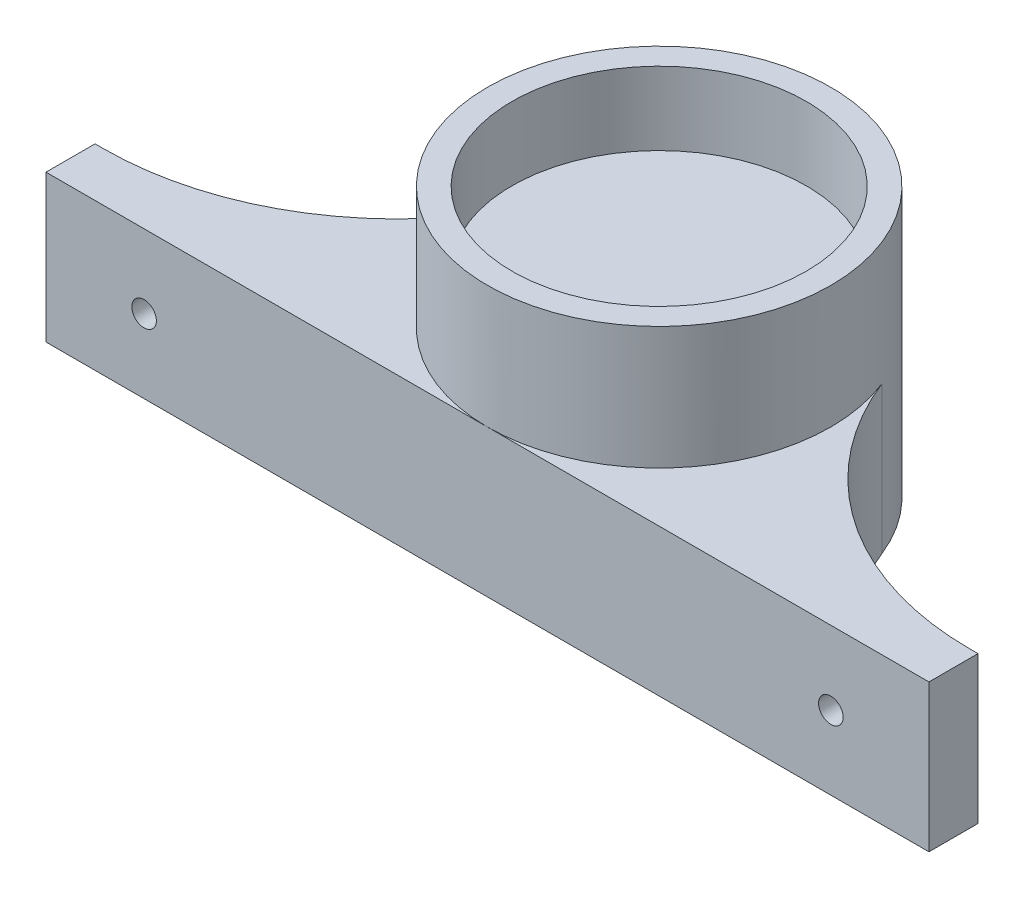
ISO-10303-21;
HEADER;
FILE_DESCRIPTION(('STEP AP214'),'2;1');
FILE_NAME('part.step','',(''),(''),'','','');
FILE_SCHEMA(('AUTOMOTIVE_DESIGN { 1 0 10303 214 1 1 1 1 }'));
ENDSEC;
DATA;
#1=APPLICATION_CONTEXT('core data for automotive mechanical design processes');
#2=APPLICATION_PROTOCOL_DEFINITION('international standard','automotive_design',2000,#1);
#3=PRODUCT_CONTEXT('',#1,'mechanical');
#4=PRODUCT('Part','Part','',(#3));
#5=PRODUCT_RELATED_PRODUCT_CATEGORY('part','',(#4));
#6=PRODUCT_DEFINITION_FORMATION('','',#4);
#7=PRODUCT_DEFINITION_CONTEXT('part definition',#1,'design');
#8=PRODUCT_DEFINITION('design','',#6,#7);
#9=PRODUCT_DEFINITION_SHAPE('','',#8);
#10=(LENGTH_UNIT() NAMED_UNIT(*) SI_UNIT(.MILLI.,.METRE.));
#11=(NAMED_UNIT(*) PLANE_ANGLE_UNIT() SI_UNIT($,.RADIAN.));
#12=(NAMED_UNIT(*) SI_UNIT($,.STERADIAN.) SOLID_ANGLE_UNIT());
#13=UNCERTAINTY_MEASURE_WITH_UNIT(LENGTH_MEASURE(1.E-05),#10,'distance_accuracy_value','');
#14=(GEOMETRIC_REPRESENTATION_CONTEXT(3) GLOBAL_UNCERTAINTY_ASSIGNED_CONTEXT((#13)) GLOBAL_UNIT_ASSIGNED_CONTEXT((#10,
#11,#12)) REPRESENTATION_CONTEXT('',''));
#15=CARTESIAN_POINT('',(0.,0.,0.));
#16=DIRECTION('',(0.,0.,1.));
#17=DIRECTION('',(1.,0.,0.));
#18=AXIS2_PLACEMENT_3D('',#15,#16,#17);
#19=CARTESIAN_POINT('',(0.,31.75,0.));
#20=DIRECTION('',(0.,1.,0.));
#21=DIRECTION('',(1.,0.,0.));
#22=AXIS2_PLACEMENT_3D('',#19,#20,#21);
#23=PLANE('',#22);
#24=CARTESIAN_POINT('',(0.,31.75,0.));
#25=DIRECTION('',(0.,-1.,0.));
#26=DIRECTION('',(1.,0.,0.));
#27=AXIS2_PLACEMENT_3D('',#24,#25,#26);
#28=CIRCLE('',#27,38.1);
#29=CARTESIAN_POINT('',(38.1,31.75,0.));
#30=VERTEX_POINT('',#29);
#31=EDGE_CURVE('E31',#30,#30,#28,.T.);
#32=ORIENTED_EDGE('',*,*,#31,.T.);
#33=EDGE_LOOP('',(#32));
#34=FACE_BOUND('',#33,.T.);
#35=CARTESIAN_POINT('',(0.,31.75,0.));
#36=DIRECTION('',(0.,1.,0.));
#37=DIRECTION('',(-1.,0.,0.));
#38=AXIS2_PLACEMENT_3D('',#35,#36,#37);
#39=CIRCLE('',#38,44.45);
#40=CARTESIAN_POINT('',(-44.45,31.75,0.));
#41=VERTEX_POINT('',#40);
#42=EDGE_CURVE('E221',#41,#41,#39,.T.);
#43=ORIENTED_EDGE('',*,*,#42,.T.);
#44=EDGE_LOOP('',(#43));
#45=FACE_BOUND('',#44,.T.);
#46=ADVANCED_FACE('F17',(#34,#45),#23,.T.);
#47=CARTESIAN_POINT('',(0.,12.827,0.));
#48=DIRECTION('',(0.,1.,0.));
#49=DIRECTION('',(1.,0.,0.));
#50=AXIS2_PLACEMENT_3D('',#47,#48,#49);
#51=PLANE('',#50);
#52=CARTESIAN_POINT('',(0.,12.827,0.));
#53=DIRECTION('',(0.,-1.,0.));
#54=DIRECTION('',(1.,0.,0.));
#55=AXIS2_PLACEMENT_3D('',#52,#53,#54);
#56=CIRCLE('',#55,38.1);
#57=CARTESIAN_POINT('',(38.1,12.827,0.));
#58=VERTEX_POINT('',#57);
#59=EDGE_CURVE('E11',#58,#58,#56,.T.);
#60=ORIENTED_EDGE('',*,*,#59,.F.);
#61=EDGE_LOOP('',(#60));
#62=FACE_BOUND('',#61,.T.);
#63=ADVANCED_FACE('F210',(#62),#51,.T.);
#64=CARTESIAN_POINT('',(0.,31.75,0.));
#65=DIRECTION('',(0.,-1.,0.));
#66=DIRECTION('',(1.,0.,0.));
#67=AXIS2_PLACEMENT_3D('',#64,#65,#66);
#68=CYLINDRICAL_SURFACE('',#67,38.1);
#69=ORIENTED_EDGE('',*,*,#59,.T.);
#70=EDGE_LOOP('',(#69));
#71=FACE_BOUND('',#70,.T.);
#72=ORIENTED_EDGE('',*,*,#31,.F.);
#73=EDGE_LOOP('',(#72));
#74=FACE_BOUND('',#73,.T.);
#75=ADVANCED_FACE('F215',(#71,#74),#68,.F.);
#76=CARTESIAN_POINT('',(0.,0.,0.));
#77=DIRECTION('',(0.,-1.,0.));
#78=DIRECTION('',(0.,0.,-1.));
#79=AXIS2_PLACEMENT_3D('',#76,#77,#78);
#80=PLANE('',#79);
#81=CARTESIAN_POINT('',(0.,0.,0.));
#82=DIRECTION('',(0.,1.,0.));
#83=DIRECTION('',(-1.,0.,0.));
#84=AXIS2_PLACEMENT_3D('',#81,#82,#83);
#85=CIRCLE('',#84,44.45);
#86=CARTESIAN_POINT('',(-41.3233442640289,0.,-16.3763157894737));
#87=VERTEX_POINT('',#86);
#88=CARTESIAN_POINT('',(0.,0.,44.45));
#89=VERTEX_POINT('',#88);
#90=EDGE_CURVE('E241',#87,#89,#85,.T.);
#91=ORIENTED_EDGE('',*,*,#90,.F.);
#92=CARTESIAN_POINT('',(-112.163363002364,0.,-44.45));
#93=DIRECTION('',(0.,1.,0.));
#94=DIRECTION('',(0.561951486949016,0.,0.827170191868511));
#95=AXIS2_PLACEMENT_3D('',#92,#93,#94);
#96=CIRCLE('',#95,76.2);
#97=CARTESIAN_POINT('',(-112.163363002364,0.,31.75));
#98=VERTEX_POINT('',#97);
#99=EDGE_CURVE('E180',#98,#87,#96,.T.);
#100=ORIENTED_EDGE('',*,*,#99,.F.);
#101=DIRECTION('',(1.,0.,0.));
#102=VECTOR('',#101,1.);
#103=CARTESIAN_POINT('',(-114.3,0.,31.75));
#104=LINE('',#103,#102);
#105=CARTESIAN_POINT('',(-114.3,0.,31.75));
#106=VERTEX_POINT('',#105);
#107=EDGE_CURVE('E160',#106,#98,#104,.T.);
#108=ORIENTED_EDGE('',*,*,#107,.F.);
#109=DIRECTION('',(0.,0.,-1.));
#110=VECTOR('',#109,1.);
#111=CARTESIAN_POINT('',(-114.3,0.,44.45));
#112=LINE('',#111,#110);
#113=CARTESIAN_POINT('',(-114.3,0.,44.45));
#114=VERTEX_POINT('',#113);
#115=EDGE_CURVE('E161',#114,#106,#112,.T.);
#116=ORIENTED_EDGE('',*,*,#115,.F.);
#117=DIRECTION('',(-1.,0.,0.));
#118=VECTOR('',#117,1.);
#119=CARTESIAN_POINT('',(114.3,0.,44.45));
#120=LINE('',#119,#118);
#121=EDGE_CURVE('E170',#89,#114,#120,.T.);
#122=ORIENTED_EDGE('',*,*,#121,.F.);
#123=EDGE_LOOP('',(#91,#100,#108,#116,#122));
#124=FACE_BOUND('',#123,.T.);
#125=ADVANCED_FACE('F287',(#124),#80,.F.);
#126=CARTESIAN_POINT('',(0.,-38.1,0.));
#127=DIRECTION('',(0.,-1.,0.));
#128=DIRECTION('',(0.,0.,-1.));
#129=AXIS2_PLACEMENT_3D('',#126,#127,#128);
#130=PLANE('',#129);
#131=CARTESIAN_POINT('',(20.8596500450033,-38.1,-20.8596500450031));
#132=DIRECTION('',(0.,1.,0.));
#133=DIRECTION('',(1.,0.,0.));
#134=AXIS2_PLACEMENT_3D('',#131,#132,#133);
#135=CIRCLE('',#134,1.5);
#136=CARTESIAN_POINT('',(22.3596500450033,-38.1,-20.8596500450031));
#137=VERTEX_POINT('',#136);
#138=EDGE_CURVE('E242',#137,#137,#135,.T.);
#139=ORIENTED_EDGE('',*,*,#138,.T.);
#140=EDGE_LOOP('',(#139));
#141=FACE_BOUND('',#140,.T.);
#142=CARTESIAN_POINT('',(-20.8596500450031,-38.1,-20.8596500450033));
#143=DIRECTION('',(0.,1.,0.));
#144=DIRECTION('',(1.,0.,0.));
#145=AXIS2_PLACEMENT_3D('',#142,#143,#144);
#146=CIRCLE('',#145,1.5);
#147=CARTESIAN_POINT('',(-19.3596500450031,-38.1,-20.8596500450033));
#148=VERTEX_POINT('',#147);
#149=EDGE_CURVE('E307',#148,#148,#146,.T.);
#150=ORIENTED_EDGE('',*,*,#149,.T.);
#151=EDGE_LOOP('',(#150));
#152=FACE_BOUND('',#151,.T.);
#153=CARTESIAN_POINT('',(20.8596500450031,-38.1,20.8596500450033));
#154=DIRECTION('',(0.,1.,0.));
#155=DIRECTION('',(1.,0.,0.));
#156=AXIS2_PLACEMENT_3D('',#153,#154,#155);
#157=CIRCLE('',#156,1.5);
#158=CARTESIAN_POINT('',(22.3596500450031,-38.1,20.8596500450033));
#159=VERTEX_POINT('',#158);
#160=EDGE_CURVE('E314',#159,#159,#157,.T.);
#161=ORIENTED_EDGE('',*,*,#160,.T.);
#162=EDGE_LOOP('',(#161));
#163=FACE_BOUND('',#162,.T.);
#164=CARTESIAN_POINT('',(-20.8596500450033,-38.1,20.8596500450031));
#165=DIRECTION('',(0.,1.,0.));
#166=DIRECTION('',(1.,0.,0.));
#167=AXIS2_PLACEMENT_3D('',#164,#165,#166);
#168=CIRCLE('',#167,1.5);
#169=CARTESIAN_POINT('',(-19.3596500450033,-38.1,20.8596500450031));
#170=VERTEX_POINT('',#169);
#171=EDGE_CURVE('E325',#170,#170,#168,.T.);
#172=ORIENTED_EDGE('',*,*,#171,.T.);
#173=EDGE_LOOP('',(#172));
#174=FACE_BOUND('',#173,.T.);
#175=DIRECTION('',(1.,0.,0.));
#176=VECTOR('',#175,1.);
#177=CARTESIAN_POINT('',(0.,-38.1,31.75));
#178=LINE('',#177,#176);
#179=CARTESIAN_POINT('',(112.163363002364,-38.1,31.75));
#180=VERTEX_POINT('',#179);
#181=CARTESIAN_POINT('',(114.3,-38.1,31.75));
#182=VERTEX_POINT('',#181);
#183=EDGE_CURVE('E122',#180,#182,#178,.T.);
#184=ORIENTED_EDGE('',*,*,#183,.T.);
#185=DIRECTION('',(0.,0.,1.));
#186=VECTOR('',#185,1.);
#187=CARTESIAN_POINT('',(114.3,-38.1,31.75));
#188=LINE('',#187,#186);
#189=CARTESIAN_POINT('',(114.3,-38.1,44.45));
#190=VERTEX_POINT('',#189);
#191=EDGE_CURVE('E44',#182,#190,#188,.T.);
#192=ORIENTED_EDGE('',*,*,#191,.T.);
#193=DIRECTION('',(-1.,0.,0.));
#194=VECTOR('',#193,1.);
#195=CARTESIAN_POINT('',(114.3,-38.1,44.45));
#196=LINE('',#195,#194);
#197=CARTESIAN_POINT('',(-114.3,-38.1,44.45));
#198=VERTEX_POINT('',#197);
#199=EDGE_CURVE('E51',#190,#198,#196,.T.);
#200=ORIENTED_EDGE('',*,*,#199,.T.);
#201=DIRECTION('',(0.,0.,-1.));
#202=VECTOR('',#201,1.);
#203=CARTESIAN_POINT('',(-114.3,-38.1,44.45));
#204=LINE('',#203,#202);
#205=CARTESIAN_POINT('',(-114.3,-38.1,31.75));
#206=VERTEX_POINT('',#205);
#207=EDGE_CURVE('E164',#198,#206,#204,.T.);
#208=ORIENTED_EDGE('',*,*,#207,.T.);
#209=DIRECTION('',(1.,0.,0.));
#210=VECTOR('',#209,1.);
#211=CARTESIAN_POINT('',(-114.3,-38.1,31.75));
#212=LINE('',#211,#210);
#213=CARTESIAN_POINT('',(-112.163363002364,-38.1,31.75));
#214=VERTEX_POINT('',#213);
#215=EDGE_CURVE('E150',#206,#214,#212,.T.);
#216=ORIENTED_EDGE('',*,*,#215,.T.);
#217=CARTESIAN_POINT('',(-112.163363002364,-38.1,-44.45));
#218=DIRECTION('',(0.,-1.,0.));
#219=DIRECTION('',(0.561951486949016,0.,0.827170191868511));
#220=AXIS2_PLACEMENT_3D('',#217,#218,#219);
#221=CIRCLE('',#220,76.2);
#222=CARTESIAN_POINT('',(-41.3233442640286,-38.1,-16.3763157894737));
#223=VERTEX_POINT('',#222);
#224=EDGE_CURVE('E234',#223,#214,#221,.T.);
#225=ORIENTED_EDGE('',*,*,#224,.F.);
#226=CARTESIAN_POINT('',(0.,-38.1,0.));
#227=DIRECTION('',(0.,-1.,0.));
#228=DIRECTION('',(1.,0.,0.));
#229=AXIS2_PLACEMENT_3D('',#226,#227,#228);
#230=CIRCLE('',#229,44.45);
#231=CARTESIAN_POINT('',(41.3233442640289,-38.1,-16.3763157894737));
#232=VERTEX_POINT('',#231);
#233=EDGE_CURVE('E238',#223,#232,#230,.T.);
#234=ORIENTED_EDGE('',*,*,#233,.T.);
#235=CARTESIAN_POINT('',(112.163363002364,-38.1,-44.45));
#236=DIRECTION('',(0.,-1.,0.));
#237=DIRECTION('',(-0.561951486949017,0.,0.827170191868511));
#238=AXIS2_PLACEMENT_3D('',#235,#236,#237);
#239=CIRCLE('',#238,76.2);
#240=EDGE_CURVE('E125',#180,#232,#239,.T.);
#241=ORIENTED_EDGE('',*,*,#240,.F.);
#242=EDGE_LOOP('',(#184,#192,#200,#208,#216,#225,#234,#241));
#243=FACE_BOUND('',#242,.T.);
#244=ADVANCED_FACE('F123',(#141,#152,#163,#174,#243),#130,.T.);
#245=CARTESIAN_POINT('',(114.3,0.,31.75));
#246=DIRECTION('',(1.,0.,0.));
#247=DIRECTION('',(0.,0.,-1.));
#248=AXIS2_PLACEMENT_3D('',#245,#246,#247);
#249=PLANE('',#248);
#250=DIRECTION('',(0.,0.,1.));
#251=VECTOR('',#250,1.);
#252=CARTESIAN_POINT('',(114.3,0.,31.75));
#253=LINE('',#252,#251);
#254=CARTESIAN_POINT('',(114.3,0.,31.75));
#255=VERTEX_POINT('',#254);
#256=CARTESIAN_POINT('',(114.3,0.,44.45));
#257=VERTEX_POINT('',#256);
#258=EDGE_CURVE('E147',#255,#257,#253,.T.);
#259=ORIENTED_EDGE('',*,*,#258,.T.);
#260=DIRECTION('',(0.,-1.,0.));
#261=VECTOR('',#260,1.);
#262=CARTESIAN_POINT('',(114.3,0.,44.45));
#263=LINE('',#262,#261);
#264=EDGE_CURVE('E118',#257,#190,#263,.T.);
#265=ORIENTED_EDGE('',*,*,#264,.T.);
#266=ORIENTED_EDGE('',*,*,#191,.F.);
#267=DIRECTION('',(0.,-1.,0.));
#268=VECTOR('',#267,1.);
#269=CARTESIAN_POINT('',(114.3,0.,31.75));
#270=LINE('',#269,#268);
#271=EDGE_CURVE('E116',#255,#182,#270,.T.);
#272=ORIENTED_EDGE('',*,*,#271,.F.);
#273=EDGE_LOOP('',(#259,#265,#266,#272));
#274=FACE_BOUND('',#273,.T.);
#275=ADVANCED_FACE('F114',(#274),#249,.T.);
#276=CARTESIAN_POINT('',(114.3,0.,44.45));
#277=DIRECTION('',(0.,0.,1.));
#278=DIRECTION('',(1.,0.,0.));
#279=AXIS2_PLACEMENT_3D('',#276,#277,#278);
#280=PLANE('',#279);
#281=CARTESIAN_POINT('',(-88.9,-19.05,44.45));
#282=DIRECTION('',(0.,0.,-1.));
#283=DIRECTION('',(1.,0.,0.));
#284=AXIS2_PLACEMENT_3D('',#281,#282,#283);
#285=CIRCLE('',#284,3.175);
#286=CARTESIAN_POINT('',(-85.725,-19.05,44.45));
#287=VERTEX_POINT('',#286);
#288=EDGE_CURVE('E181',#287,#287,#285,.T.);
#289=ORIENTED_EDGE('',*,*,#288,.T.);
#290=EDGE_LOOP('',(#289));
#291=FACE_BOUND('',#290,.T.);
#292=CARTESIAN_POINT('',(88.9,-19.05,44.45));
#293=DIRECTION('',(0.,0.,-1.));
#294=DIRECTION('',(1.,0.,0.));
#295=AXIS2_PLACEMENT_3D('',#292,#293,#294);
#296=CIRCLE('',#295,3.175);
#297=CARTESIAN_POINT('',(92.075,-19.05,44.45));
#298=VERTEX_POINT('',#297);
#299=EDGE_CURVE('E251',#298,#298,#296,.T.);
#300=ORIENTED_EDGE('',*,*,#299,.T.);
#301=EDGE_LOOP('',(#300));
#302=FACE_BOUND('',#301,.T.);
#303=DIRECTION('',(-1.,0.,0.));
#304=VECTOR('',#303,1.);
#305=CARTESIAN_POINT('',(114.3,0.,44.45));
#306=LINE('',#305,#304);
#307=EDGE_CURVE('E130',#257,#89,#306,.T.);
#308=ORIENTED_EDGE('',*,*,#307,.T.);
#309=ORIENTED_EDGE('',*,*,#121,.T.);
#310=DIRECTION('',(0.,-1.,0.));
#311=VECTOR('',#310,1.);
#312=CARTESIAN_POINT('',(-114.3,0.,44.45));
#313=LINE('',#312,#311);
#314=EDGE_CURVE('E167',#114,#198,#313,.T.);
#315=ORIENTED_EDGE('',*,*,#314,.T.);
#316=ORIENTED_EDGE('',*,*,#199,.F.);
#317=ORIENTED_EDGE('',*,*,#264,.F.);
#318=EDGE_LOOP('',(#308,#309,#315,#316,#317));
#319=FACE_BOUND('',#318,.T.);
#320=ADVANCED_FACE('F205',(#291,#302,#319),#280,.T.);
#321=CARTESIAN_POINT('',(-114.3,0.,44.45));
#322=DIRECTION('',(-1.,0.,0.));
#323=DIRECTION('',(0.,0.,1.));
#324=AXIS2_PLACEMENT_3D('',#321,#322,#323);
#325=PLANE('',#324);
#326=ORIENTED_EDGE('',*,*,#115,.T.);
#327=DIRECTION('',(0.,-1.,0.));
#328=VECTOR('',#327,1.);
#329=CARTESIAN_POINT('',(-114.3,0.,31.75));
#330=LINE('',#329,#328);
#331=EDGE_CURVE('E156',#106,#206,#330,.T.);
#332=ORIENTED_EDGE('',*,*,#331,.T.);
#333=ORIENTED_EDGE('',*,*,#207,.F.);
#334=ORIENTED_EDGE('',*,*,#314,.F.);
#335=EDGE_LOOP('',(#326,#332,#333,#334));
#336=FACE_BOUND('',#335,.T.);
#337=ADVANCED_FACE('F196',(#336),#325,.T.);
#338=CARTESIAN_POINT('',(-114.3,0.,31.75));
#339=DIRECTION('',(0.,0.,-1.));
#340=DIRECTION('',(0.,-1.,0.));
#341=AXIS2_PLACEMENT_3D('',#338,#339,#340);
#342=PLANE('',#341);
#343=DIRECTION('',(0.,1.,0.));
#344=VECTOR('',#343,1.);
#345=CARTESIAN_POINT('',(-112.163363002364,0.,31.75));
#346=LINE('',#345,#344);
#347=EDGE_CURVE('E225',#214,#98,#346,.T.);
#348=ORIENTED_EDGE('',*,*,#347,.F.);
#349=ORIENTED_EDGE('',*,*,#215,.F.);
#350=ORIENTED_EDGE('',*,*,#331,.F.);
#351=ORIENTED_EDGE('',*,*,#107,.T.);
#352=EDGE_LOOP('',(#348,#349,#350,#351));
#353=FACE_BOUND('',#352,.T.);
#354=ADVANCED_FACE('F193',(#353),#342,.T.);
#355=CARTESIAN_POINT('',(0.,0.,0.));
#356=DIRECTION('',(0.,-1.,0.));
#357=DIRECTION('',(0.,0.,-1.));
#358=AXIS2_PLACEMENT_3D('',#355,#356,#357);
#359=PLANE('',#358);
#360=CARTESIAN_POINT('',(0.,0.,0.));
#361=DIRECTION('',(0.,1.,0.));
#362=DIRECTION('',(-1.,0.,0.));
#363=AXIS2_PLACEMENT_3D('',#360,#361,#362);
#364=CIRCLE('',#363,44.45);
#365=CARTESIAN_POINT('',(41.3233442640289,0.,-16.3763157894737));
#366=VERTEX_POINT('',#365);
#367=EDGE_CURVE('E224',#89,#366,#364,.T.);
#368=ORIENTED_EDGE('',*,*,#367,.F.);
#369=ORIENTED_EDGE('',*,*,#307,.F.);
#370=ORIENTED_EDGE('',*,*,#258,.F.);
#371=DIRECTION('',(1.,0.,0.));
#372=VECTOR('',#371,1.);
#373=CARTESIAN_POINT('',(0.,0.,31.75));
#374=LINE('',#373,#372);
#375=CARTESIAN_POINT('',(112.163363002364,0.,31.75));
#376=VERTEX_POINT('',#375);
#377=EDGE_CURVE('E133',#376,#255,#374,.T.);
#378=ORIENTED_EDGE('',*,*,#377,.F.);
#379=CARTESIAN_POINT('',(112.163363002364,0.,-44.45));
#380=DIRECTION('',(0.,1.,0.));
#381=DIRECTION('',(-0.561951486949017,0.,0.827170191868511));
#382=AXIS2_PLACEMENT_3D('',#379,#380,#381);
#383=CIRCLE('',#382,76.2);
#384=EDGE_CURVE('E252',#366,#376,#383,.T.);
#385=ORIENTED_EDGE('',*,*,#384,.F.);
#386=EDGE_LOOP('',(#368,#369,#370,#378,#385));
#387=FACE_BOUND('',#386,.T.);
#388=ADVANCED_FACE('F195',(#387),#359,.F.);
#389=CARTESIAN_POINT('',(31.1085197333464,0.,31.75));
#390=DIRECTION('',(0.,0.,-1.));
#391=DIRECTION('',(0.,-1.,0.));
#392=AXIS2_PLACEMENT_3D('',#389,#390,#391);
#393=PLANE('',#392);
#394=DIRECTION('',(0.,-1.,0.));
#395=VECTOR('',#394,1.);
#396=CARTESIAN_POINT('',(112.163363002364,0.,31.75));
#397=LINE('',#396,#395);
#398=EDGE_CURVE('E141',#376,#180,#397,.T.);
#399=ORIENTED_EDGE('',*,*,#398,.F.);
#400=ORIENTED_EDGE('',*,*,#377,.T.);
#401=ORIENTED_EDGE('',*,*,#271,.T.);
#402=ORIENTED_EDGE('',*,*,#183,.F.);
#403=EDGE_LOOP('',(#399,#400,#401,#402));
#404=FACE_BOUND('',#403,.T.);
#405=ADVANCED_FACE('F132',(#404),#393,.T.);
#406=CARTESIAN_POINT('',(112.163363002364,0.,-44.45));
#407=DIRECTION('',(0.,-1.,0.));
#408=DIRECTION('',(-0.561951486949017,0.,0.827170191868511));
#409=AXIS2_PLACEMENT_3D('',#406,#407,#408);
#410=CYLINDRICAL_SURFACE('',#409,76.2);
#411=CARTESIAN_POINT('',(92.075,-19.05,29.0544057991442));
#412=CARTESIAN_POINT('',(92.0749921770069,-18.8766766499208,29.0544041575793));
#413=CARTESIAN_POINT('',(92.0607412810292,-18.7031164243601,29.0505135517775));
#414=CARTESIAN_POINT('',(92.0041543446147,-18.3607449940921,29.035012997145));
#415=CARTESIAN_POINT('',(91.9617583116776,-18.1919447384164,29.0233865589538));
#416=CARTESIAN_POINT('',(91.8503739546823,-17.8643415489801,28.9926700662075));
#417=CARTESIAN_POINT('',(91.7814250042019,-17.7055242158977,28.973591061977));
#418=CARTESIAN_POINT('',(91.6192656239623,-17.402024534575,28.9283831358735));
#419=CARTESIAN_POINT('',(91.5260654911455,-17.2573362229883,28.9022572059213));
#420=CARTESIAN_POINT('',(91.316920953681,-16.9838047225385,28.8430951013783));
#421=CARTESIAN_POINT('',(91.2006803451377,-16.8552078314373,28.8099685156811));
#422=CARTESIAN_POINT('',(90.94988764278,-16.6193129297004,28.7377412477881));
#423=CARTESIAN_POINT('',(90.8153315760592,-16.512019552576,28.6986392692107));
#424=CARTESIAN_POINT('',(90.5270209162275,-16.317850287472,28.6138897970299));
#425=CARTESIAN_POINT('',(90.3727710378486,-16.2317873534412,28.5680656990952));
#426=CARTESIAN_POINT('',(90.0533423714475,-16.0866879023315,28.4719775164272));
#427=CARTESIAN_POINT('',(89.8881615403202,-16.0276564541319,28.4217126010689));
#428=CARTESIAN_POINT('',(89.5445355411901,-15.9358258883771,28.3158039062627));
#429=CARTESIAN_POINT('',(89.3658240869981,-15.9041783497447,28.2600250558414));
#430=CARTESIAN_POINT('',(89.0062919002556,-15.8716471346545,28.1463196719446));
#431=CARTESIAN_POINT('',(88.8254707542603,-15.870769593173,28.08839271248));
#432=CARTESIAN_POINT('',(88.4606467575762,-15.9000552294887,27.9700192160533));
#433=CARTESIAN_POINT('',(88.2767308284395,-15.9312257396235,27.9095518816686));
#434=CARTESIAN_POINT('',(87.9168031868053,-16.0253414218356,27.7897421308236));
#435=CARTESIAN_POINT('',(87.7407924666719,-16.0882905711058,27.7303998561327));
#436=CARTESIAN_POINT('',(87.400496224097,-16.2451024722036,27.614366974539));
#437=CARTESIAN_POINT('',(87.236301208933,-16.3391781248306,27.5576977895625));
#438=CARTESIAN_POINT('',(86.9260995249373,-16.5559807071459,27.4495656481313));
#439=CARTESIAN_POINT('',(86.780089237227,-16.6787019221648,27.3981016561936));
#440=CARTESIAN_POINT('',(86.5152966299465,-16.9456992071408,27.3039956093425));
#441=CARTESIAN_POINT('',(86.3958257206085,-17.0892132238065,27.261134232919));
#442=CARTESIAN_POINT('',(86.183011928079,-17.3966528963274,27.1843088432495));
#443=CARTESIAN_POINT('',(86.0896723045268,-17.5605810949838,27.1503459400408));
#444=CARTESIAN_POINT('',(85.9374457590756,-17.8943376973941,27.0947239143966));
#445=CARTESIAN_POINT('',(85.8769086182702,-18.0633077990997,27.0724774781398));
#446=CARTESIAN_POINT('',(85.8080659391457,-18.322944380182,27.0471249522305));
#447=CARTESIAN_POINT('',(85.7887847028201,-18.4104568722961,27.040012473967));
#448=CARTESIAN_POINT('',(85.7576719687688,-18.5869571392644,27.0285266145699));
#449=CARTESIAN_POINT('',(85.7458360157263,-18.6759439990585,27.0241515953273));
#450=CARTESIAN_POINT('',(85.7335306954894,-18.8126053736425,27.0196018061177));
#451=CARTESIAN_POINT('',(85.7303334802681,-18.86001880901,27.0184193189641));
#452=CARTESIAN_POINT('',(85.7260668948778,-18.95494821119,27.0168410887988));
#453=CARTESIAN_POINT('',(85.724997531095,-19.0024641783098,27.0164453481484));
#454=CARTESIAN_POINT('',(85.7250088449357,-19.2202986900754,27.0164501910949));
#455=CARTESIAN_POINT('',(85.7387741787582,-19.3908522046017,27.0215466937866));
#456=CARTESIAN_POINT('',(85.793366673748,-19.7272058106488,27.0417065513885));
#457=CARTESIAN_POINT('',(85.8342549531678,-19.8929942824154,27.0567924159718));
#458=CARTESIAN_POINT('',(85.941442636685,-20.2145616200041,27.0961677514752));
#459=CARTESIAN_POINT('',(86.0076841825646,-20.3703623404189,27.1204362654151));
#460=CARTESIAN_POINT('',(86.1631982006932,-20.6682657145803,27.1770775962315));
#461=CARTESIAN_POINT('',(86.2524622562022,-20.8103733483223,27.2094474512318));
#462=CARTESIAN_POINT('',(86.4539961666575,-21.0815069515577,27.2820027184674));
#463=CARTESIAN_POINT('',(86.5668450907841,-21.2100494905067,27.3223832182222));
#464=CARTESIAN_POINT('',(86.8105046333805,-21.4465572021287,27.4088148434515));
#465=CARTESIAN_POINT('',(86.9413210070104,-21.5545157549697,27.4548677853781));
#466=CARTESIAN_POINT('',(87.2253796123882,-21.7533369308565,27.553894699));
#467=CARTESIAN_POINT('',(87.3794813509551,-21.842849404143,27.6071149225788));
#468=CARTESIAN_POINT('',(87.6996071130005,-21.9946710030117,27.7164275268266));
#469=CARTESIAN_POINT('',(87.8656341179494,-22.056973297938,27.7725206247383));
#470=CARTESIAN_POINT('',(88.2132926509182,-22.1553481701954,27.8885735000797));
#471=CARTESIAN_POINT('',(88.3952908211096,-22.1900607092344,27.9485915512516));
#472=CARTESIAN_POINT('',(88.7627108340637,-22.2274022409939,28.0681826442785));
#473=CARTESIAN_POINT('',(88.948133123878,-22.2300270142623,28.1277556265788));
#474=CARTESIAN_POINT('',(89.3200933771881,-22.2026873746373,28.2456921594482));
#475=CARTESIAN_POINT('',(89.5066056823134,-22.1722286168828,28.3040237122876));
#476=CARTESIAN_POINT('',(89.8723532556373,-22.0783314123819,28.4169165254101));
#477=CARTESIAN_POINT('',(90.0515889379983,-22.0148948454733,28.4714780003985));
#478=CARTESIAN_POINT('',(90.3938475767806,-21.8578149650029,28.5743764897937));
#479=CARTESIAN_POINT('',(90.5571129389067,-21.7647652535479,28.6228116609945));
#480=CARTESIAN_POINT('',(90.8657959693362,-21.5503120285013,28.7133756476696));
#481=CARTESIAN_POINT('',(91.0112190047154,-21.4289170733794,28.7555063604033));
#482=CARTESIAN_POINT('',(91.2738524978526,-21.1662678514906,28.8308729102134));
#483=CARTESIAN_POINT('',(91.3919438562583,-21.0259758706953,28.8643921646689));
#484=CARTESIAN_POINT('',(91.6028374483073,-20.7259752770836,28.9238157708343));
#485=CARTESIAN_POINT('',(91.6956335612293,-20.5662619783628,28.9497182796302));
#486=CARTESIAN_POINT('',(91.8493938603384,-20.2387718834313,28.9924182766284));
#487=CARTESIAN_POINT('',(91.91145347044,-20.0715484263707,29.0095300576709));
#488=CARTESIAN_POINT('',(92.0066785339983,-19.728734275168,29.035716654214));
#489=CARTESIAN_POINT('',(92.0399119196761,-19.5531642871385,29.0448103660322));
#490=CARTESIAN_POINT('',(92.0637973290237,-19.3220201727657,29.0513433247057));
#491=CARTESIAN_POINT('',(92.0679948767528,-19.2677139027233,29.0524910350608));
#492=CARTESIAN_POINT('',(92.073597443895,-19.1589462244741,29.0540225308599));
#493=CARTESIAN_POINT('',(92.0750024591859,-19.1044848160384,29.0544063151761));
#494=CARTESIAN_POINT('',(92.075,-19.05,29.0544057991442));
#495=B_SPLINE_CURVE_WITH_KNOTS('',3,(#411,#412,#413,#414,#415,#416,#417,#418,#419,#420,#421,
#422,#423,#424,#425,#426,#427,#428,#429,#430,#431,#432,#433,#434,#435,#436,#437,#438,#439,#440,
#441,#442,#443,#444,#445,#446,#447,#448,#449,#450,#451,#452,#453,#454,#455,#456,#457,#458,#459,
#460,#461,#462,#463,#464,#465,#466,#467,#468,#469,#470,#471,#472,#473,#474,#475,#476,#477,#478,
#479,#480,#481,#482,#483,#484,#485,#486,#487,#488,#489,#490,#491,#492,#493,#494),.UNSPECIFIED.,
.T.,.F.,(4,2,2,2,2,2,2,2,2,2,2,2,2,2,2,2,2,2,2,2,2,2,2,2,2,2,2,2,2,2,2,2,2,2,2,2,2,2,2,2,2,4),
(0.,0.51975941738875,1.04063029561155,1.56073176419463,2.08061275937734,2.60767022509868,
3.13484220047452,3.67983766705319,4.22493528806623,4.79197472406133,5.35912721673376,
5.94466806754762,6.530282218744,7.11998767619418,7.70957559027553,8.28137484460411,
8.85324539392249,9.39276685957812,9.66215156744575,9.93137491962324,10.073931893537,
10.2164892953067,10.7272060120634,11.2390774939509,11.7497877420566,12.2603115449215,
12.7852688344515,13.3103946670905,13.8658964324424,14.4215375670926,15.0031138968566,
15.5847667014686,16.1752318353254,16.7656633145217,17.3449350154762,17.924032038689,
18.4804824804831,19.0370674479892,19.5720559213805,20.1057801823026,20.2691681760453,
20.43255641097),.UNSPECIFIED.);
#496=CARTESIAN_POINT('',(92.075,-19.05,29.0544057991442));
#497=VERTEX_POINT('',#496);
#498=EDGE_CURVE('E20',#497,#497,#495,.T.);
#499=ORIENTED_EDGE('',*,*,#498,.T.);
#500=EDGE_LOOP('',(#499));
#501=FACE_BOUND('',#500,.T.);
#502=ORIENTED_EDGE('',*,*,#384,.T.);
#503=ORIENTED_EDGE('',*,*,#398,.T.);
#504=ORIENTED_EDGE('',*,*,#240,.T.);
#505=DIRECTION('',(0.,1.,0.));
#506=VECTOR('',#505,1.);
#507=CARTESIAN_POINT('',(41.3233442640289,0.,-16.3763157894737));
#508=LINE('',#507,#506);
#509=EDGE_CURVE('E230',#232,#366,#508,.T.);
#510=ORIENTED_EDGE('',*,*,#509,.T.);
#511=EDGE_LOOP('',(#502,#503,#504,#510));
#512=FACE_BOUND('',#511,.T.);
#513=ADVANCED_FACE('F294',(#501,#512),#410,.F.);
#514=CARTESIAN_POINT('',(0.,0.,0.));
#515=DIRECTION('',(0.,1.,0.));
#516=DIRECTION('',(-1.,0.,0.));
#517=AXIS2_PLACEMENT_3D('',#514,#515,#516);
#518=CYLINDRICAL_SURFACE('',#517,44.45);
#519=ORIENTED_EDGE('',*,*,#90,.T.);
#520=ORIENTED_EDGE('',*,*,#367,.T.);
#521=ORIENTED_EDGE('',*,*,#509,.F.);
#522=ORIENTED_EDGE('',*,*,#233,.F.);
#523=DIRECTION('',(0.,-1.,0.));
#524=VECTOR('',#523,1.);
#525=CARTESIAN_POINT('',(-41.3233442640289,0.,-16.3763157894737));
#526=LINE('',#525,#524);
#527=EDGE_CURVE('E268',#87,#223,#526,.T.);
#528=ORIENTED_EDGE('',*,*,#527,.F.);
#529=EDGE_LOOP('',(#519,#520,#521,#522,#528));
#530=FACE_BOUND('',#529,.T.);
#531=ORIENTED_EDGE('',*,*,#42,.F.);
#532=EDGE_LOOP('',(#531));
#533=FACE_BOUND('',#532,.T.);
#534=ADVANCED_FACE('F191',(#530,#533),#518,.T.);
#535=CARTESIAN_POINT('',(-112.163363002364,0.,-44.45));
#536=DIRECTION('',(0.,-1.,0.));
#537=DIRECTION('',(0.561951486949016,0.,0.827170191868511));
#538=AXIS2_PLACEMENT_3D('',#535,#536,#537);
#539=CYLINDRICAL_SURFACE('',#538,76.2);
#540=CARTESIAN_POINT('',(-85.725,-19.05,27.0164464049756));
#541=CARTESIAN_POINT('',(-85.7250088449357,-18.8797013099246,27.0164501910949));
#542=CARTESIAN_POINT('',(-85.7387741787582,-18.7091477953983,27.0215466937866));
#543=CARTESIAN_POINT('',(-85.793366673748,-18.3727941893512,27.0417065513884));
#544=CARTESIAN_POINT('',(-85.8342549531678,-18.2070057175846,27.0567924159718));
#545=CARTESIAN_POINT('',(-85.941442636685,-17.8854383799959,27.0961677514752));
#546=CARTESIAN_POINT('',(-86.0076841825646,-17.7296376595811,27.1204362654151));
#547=CARTESIAN_POINT('',(-86.1631982006932,-17.4317342854197,27.1770775962315));
#548=CARTESIAN_POINT('',(-86.2524622562022,-17.2896266516777,27.2094474512318));
#549=CARTESIAN_POINT('',(-86.4539961666575,-17.0184930484423,27.2820027184674));
#550=CARTESIAN_POINT('',(-86.5668450907841,-16.8899505094933,27.3223832182222));
#551=CARTESIAN_POINT('',(-86.8105046333805,-16.6534427978713,27.4088148434515));
#552=CARTESIAN_POINT('',(-86.9413210070104,-16.5454842450303,27.4548677853781));
#553=CARTESIAN_POINT('',(-87.2253796123881,-16.3466630691435,27.553894699));
#554=CARTESIAN_POINT('',(-87.3794813509551,-16.257150595857,27.6071149225788));
#555=CARTESIAN_POINT('',(-87.6996071130005,-16.1053289969883,27.7164275268266));
#556=CARTESIAN_POINT('',(-87.8656341179494,-16.043026702062,27.7725206247383));
#557=CARTESIAN_POINT('',(-88.2132926509181,-15.9446518298046,27.8885735000797));
#558=CARTESIAN_POINT('',(-88.3952908211096,-15.9099392907656,27.9485915512516));
#559=CARTESIAN_POINT('',(-88.7627108340637,-15.8725977590061,28.0681826442784));
#560=CARTESIAN_POINT('',(-88.948133123878,-15.8699729857377,28.1277556265788));
#561=CARTESIAN_POINT('',(-89.320093377188,-15.8973126253627,28.2456921594482));
#562=CARTESIAN_POINT('',(-89.5066056823133,-15.9277713831172,28.3040237122876));
#563=CARTESIAN_POINT('',(-89.8723532556373,-16.0216685876181,28.4169165254101));
#564=CARTESIAN_POINT('',(-90.0515889379982,-16.0851051545267,28.4714780003985));
#565=CARTESIAN_POINT('',(-90.3938475767806,-16.2421850349971,28.5743764897936));
#566=CARTESIAN_POINT('',(-90.5571129389066,-16.3352347464521,28.6228116609945));
#567=CARTESIAN_POINT('',(-90.8657959693362,-16.5496879714987,28.7133756476696));
#568=CARTESIAN_POINT('',(-91.0112190047153,-16.6710829266206,28.7555063604033));
#569=CARTESIAN_POINT('',(-91.2738524978526,-16.9337321485094,28.8308729102134));
#570=CARTESIAN_POINT('',(-91.3919438562582,-17.0740241293047,28.8643921646689));
#571=CARTESIAN_POINT('',(-91.6028374483073,-17.3740247229164,28.9238157708343));
#572=CARTESIAN_POINT('',(-91.6956335612292,-17.5337380216372,28.9497182796301));
#573=CARTESIAN_POINT('',(-91.8493938603384,-17.8612281165687,28.9924182766284));
#574=CARTESIAN_POINT('',(-91.9114534704399,-18.0284515736293,29.0095300576708));
#575=CARTESIAN_POINT('',(-92.0066785339982,-18.371265724832,29.035716654214));
#576=CARTESIAN_POINT('',(-92.0399119196761,-18.5468357128615,29.0448103660322));
#577=CARTESIAN_POINT('',(-92.0637973290237,-18.7779798272343,29.0513433247056));
#578=CARTESIAN_POINT('',(-92.0679948767528,-18.8322860972767,29.0524910350608));
#579=CARTESIAN_POINT('',(-92.0735974438949,-18.9410537755259,29.0540225308599));
#580=CARTESIAN_POINT('',(-92.0750024591859,-18.9955151839616,29.0544063151761));
#581=CARTESIAN_POINT('',(-92.0749921770069,-19.2233233500792,29.0544041575794));
#582=CARTESIAN_POINT('',(-92.0607412810292,-19.3968835756399,29.0505135517775));
#583=CARTESIAN_POINT('',(-92.0041543446147,-19.7392550059079,29.035012997145));
#584=CARTESIAN_POINT('',(-91.9617583116776,-19.9080552615836,29.0233865589538));
#585=CARTESIAN_POINT('',(-91.8503739546823,-20.2356584510199,28.9926700662075));
#586=CARTESIAN_POINT('',(-91.7814250042018,-20.3944757841023,28.973591061977));
#587=CARTESIAN_POINT('',(-91.6192656239623,-20.697975465425,28.9283831358735));
#588=CARTESIAN_POINT('',(-91.5260654911455,-20.8426637770117,28.9022572059213));
#589=CARTESIAN_POINT('',(-91.316920953681,-21.1161952774615,28.8430951013783));
#590=CARTESIAN_POINT('',(-91.2006803451377,-21.2447921685627,28.8099685156811));
#591=CARTESIAN_POINT('',(-90.94988764278,-21.4806870702996,28.7377412477881));
#592=CARTESIAN_POINT('',(-90.8153315760592,-21.587980447424,28.6986392692107));
#593=CARTESIAN_POINT('',(-90.5270209162275,-21.782149712528,28.6138897970299));
#594=CARTESIAN_POINT('',(-90.3727710378486,-21.8682126465588,28.5680656990952));
#595=CARTESIAN_POINT('',(-90.0533423714475,-22.0133120976685,28.4719775164272));
#596=CARTESIAN_POINT('',(-89.8881615403201,-22.0723435458681,28.4217126010689));
#597=CARTESIAN_POINT('',(-89.5445355411901,-22.1641741116229,28.3158039062627));
#598=CARTESIAN_POINT('',(-89.365824086998,-22.1958216502553,28.2600250558414));
#599=CARTESIAN_POINT('',(-89.0062919002556,-22.2283528653455,28.1463196719446));
#600=CARTESIAN_POINT('',(-88.8254707542603,-22.229230406827,28.08839271248));
#601=CARTESIAN_POINT('',(-88.4606467575762,-22.1999447705113,27.9700192160533));
#602=CARTESIAN_POINT('',(-88.2767308284395,-22.1687742603765,27.9095518816685));
#603=CARTESIAN_POINT('',(-87.9168031868053,-22.0746585781644,27.7897421308236));
#604=CARTESIAN_POINT('',(-87.7407924666719,-22.0117094288942,27.7303998561327));
#605=CARTESIAN_POINT('',(-87.400496224097,-21.8548975277964,27.614366974539));
#606=CARTESIAN_POINT('',(-87.2363012089329,-21.7608218751694,27.5576977895625));
#607=CARTESIAN_POINT('',(-86.9260995249373,-21.5440192928541,27.4495656481312));
#608=CARTESIAN_POINT('',(-86.780089237227,-21.4212980778352,27.3981016561936));
#609=CARTESIAN_POINT('',(-86.5152966299465,-21.1543007928593,27.3039956093424));
#610=CARTESIAN_POINT('',(-86.3958257206085,-21.0107867761935,27.261134232919));
#611=CARTESIAN_POINT('',(-86.183011928079,-20.7033471036726,27.1843088432495));
#612=CARTESIAN_POINT('',(-86.0896723045268,-20.5394189050162,27.1503459400408));
#613=CARTESIAN_POINT('',(-85.9374457590756,-20.205662302606,27.0947239143966));
#614=CARTESIAN_POINT('',(-85.8769086182702,-20.0366922009003,27.0724774781398));
#615=CARTESIAN_POINT('',(-85.8080659391457,-19.777055619818,27.0471249522305));
#616=CARTESIAN_POINT('',(-85.7887847028201,-19.6895431277039,27.040012473967));
#617=CARTESIAN_POINT('',(-85.7576719687688,-19.5130428607356,27.0285266145699));
#618=CARTESIAN_POINT('',(-85.7458360157262,-19.4240560009415,27.0241515953273));
#619=CARTESIAN_POINT('',(-85.7335306954894,-19.2873946263575,27.0196018061177));
#620=CARTESIAN_POINT('',(-85.7303334802681,-19.23998119099,27.0184193189641));
#621=CARTESIAN_POINT('',(-85.7260668948778,-19.14505178881,27.0168410887988));
#622=CARTESIAN_POINT('',(-85.724997531095,-19.0975358216902,27.0164453481484));
#623=CARTESIAN_POINT('',(-85.725,-19.05,27.0164464049756));
#624=B_SPLINE_CURVE_WITH_KNOTS('',3,(#540,#541,#542,#543,#544,#545,#546,#547,#548,#549,#550,
#551,#552,#553,#554,#555,#556,#557,#558,#559,#560,#561,#562,#563,#564,#565,#566,#567,#568,#569,
#570,#571,#572,#573,#574,#575,#576,#577,#578,#579,#580,#581,#582,#583,#584,#585,#586,#587,#588,
#589,#590,#591,#592,#593,#594,#595,#596,#597,#598,#599,#600,#601,#602,#603,#604,#605,#606,#607,
#608,#609,#610,#611,#612,#613,#614,#615,#616,#617,#618,#619,#620,#621,#622,#623),.UNSPECIFIED.,
.T.,.F.,(4,2,2,2,2,2,2,2,2,2,2,2,2,2,2,2,2,2,2,2,2,2,2,2,2,2,2,2,2,2,2,2,2,2,2,2,2,2,2,2,2,4),
(0.,0.51071671675665,1.0225881986442,1.5332984467499,2.04382224961475,2.5687795391448,
3.09390537178373,3.64940713713573,4.20504827178586,4.78662460154996,5.36827740616187,
5.95874254001861,6.54917401921499,7.12844572016949,7.70754274338227,8.26399318517637,
8.82057815268248,9.35556662607377,9.88929088699591,10.0526788807386,10.2160671156633,
10.735826533052,11.2566974112748,11.7767988798579,12.2966798750406,12.823737340762,
13.3509093161378,13.8959047827165,14.4410024037295,15.0080418397246,15.575194332397,
16.1607351832109,16.7463493344073,17.3360547918575,17.9256427059388,18.4974419602674,
19.0693125095858,19.6088339752414,19.8782186831091,20.1474420352865,20.2899990092003,
20.43255641097),.UNSPECIFIED.);
#625=CARTESIAN_POINT('',(-85.725,-19.05,27.0164464049756));
#626=VERTEX_POINT('',#625);
#627=EDGE_CURVE('E172',#626,#626,#624,.T.);
#628=ORIENTED_EDGE('',*,*,#627,.T.);
#629=EDGE_LOOP('',(#628));
#630=FACE_BOUND('',#629,.T.);
#631=ORIENTED_EDGE('',*,*,#99,.T.);
#632=ORIENTED_EDGE('',*,*,#527,.T.);
#633=ORIENTED_EDGE('',*,*,#224,.T.);
#634=ORIENTED_EDGE('',*,*,#347,.T.);
#635=EDGE_LOOP('',(#631,#632,#633,#634));
#636=FACE_BOUND('',#635,.T.);
#637=ADVANCED_FACE('F182',(#630,#636),#539,.F.);
#638=CARTESIAN_POINT('',(-88.9,-19.05,44.45));
#639=DIRECTION('',(0.,0.,-1.));
#640=DIRECTION('',(1.,0.,0.));
#641=AXIS2_PLACEMENT_3D('',#638,#639,#640);
#642=CYLINDRICAL_SURFACE('',#641,3.175);
#643=ORIENTED_EDGE('',*,*,#627,.F.);
#644=EDGE_LOOP('',(#643));
#645=FACE_BOUND('',#644,.T.);
#646=ORIENTED_EDGE('',*,*,#288,.F.);
#647=EDGE_LOOP('',(#646));
#648=FACE_BOUND('',#647,.T.);
#649=ADVANCED_FACE('F185',(#645,#648),#642,.F.);
#650=CARTESIAN_POINT('',(88.9,-19.05,44.45));
#651=DIRECTION('',(0.,0.,-1.));
#652=DIRECTION('',(1.,0.,0.));
#653=AXIS2_PLACEMENT_3D('',#650,#651,#652);
#654=CYLINDRICAL_SURFACE('',#653,3.175);
#655=ORIENTED_EDGE('',*,*,#498,.F.);
#656=EDGE_LOOP('',(#655));
#657=FACE_BOUND('',#656,.T.);
#658=ORIENTED_EDGE('',*,*,#299,.F.);
#659=EDGE_LOOP('',(#658));
#660=FACE_BOUND('',#659,.T.);
#661=ADVANCED_FACE('F189',(#657,#660),#654,.F.);
#662=CARTESIAN_POINT('',(20.8596500450033,3.175,-20.8596500450031));
#663=DIRECTION('',(0.,-1.,0.));
#664=DIRECTION('',(0.,0.,-1.));
#665=AXIS2_PLACEMENT_3D('',#662,#663,#664);
#666=PLANE('',#665);
#667=CARTESIAN_POINT('',(20.8596500450033,3.175,-20.8596500450031));
#668=DIRECTION('',(0.,1.,0.));
#669=DIRECTION('',(1.,0.,0.));
#670=AXIS2_PLACEMENT_3D('',#667,#668,#669);
#671=CIRCLE('',#670,1.5);
#672=CARTESIAN_POINT('',(22.3596500450033,3.175,-20.8596500450031));
#673=VERTEX_POINT('',#672);
#674=EDGE_CURVE('E246',#673,#673,#671,.T.);
#675=ORIENTED_EDGE('',*,*,#674,.F.);
#676=EDGE_LOOP('',(#675));
#677=FACE_BOUND('',#676,.T.);
#678=ADVANCED_FACE('F355',(#677),#666,.T.);
#679=CARTESIAN_POINT('',(20.8596500450033,-38.1,-20.8596500450031));
#680=DIRECTION('',(0.,1.,0.));
#681=DIRECTION('',(1.,0.,0.));
#682=AXIS2_PLACEMENT_3D('',#679,#680,#681);
#683=CYLINDRICAL_SURFACE('',#682,1.5);
#684=ORIENTED_EDGE('',*,*,#674,.T.);
#685=EDGE_LOOP('',(#684));
#686=FACE_BOUND('',#685,.T.);
#687=ORIENTED_EDGE('',*,*,#138,.F.);
#688=EDGE_LOOP('',(#687));
#689=FACE_BOUND('',#688,.T.);
#690=ADVANCED_FACE('F358',(#686,#689),#683,.F.);
#691=CARTESIAN_POINT('',(-20.8596500450031,3.175,-20.8596500450033));
#692=DIRECTION('',(0.,-1.,0.));
#693=DIRECTION('',(0.,0.,-1.));
#694=AXIS2_PLACEMENT_3D('',#691,#692,#693);
#695=PLANE('',#694);
#696=CARTESIAN_POINT('',(-20.8596500450031,3.175,-20.8596500450033));
#697=DIRECTION('',(0.,1.,0.));
#698=DIRECTION('',(1.,0.,0.));
#699=AXIS2_PLACEMENT_3D('',#696,#697,#698);
#700=CIRCLE('',#699,1.5);
#701=CARTESIAN_POINT('',(-19.3596500450031,3.175,-20.8596500450033));
#702=VERTEX_POINT('',#701);
#703=EDGE_CURVE('E247',#702,#702,#700,.T.);
#704=ORIENTED_EDGE('',*,*,#703,.F.);
#705=EDGE_LOOP('',(#704));
#706=FACE_BOUND('',#705,.T.);
#707=ADVANCED_FACE('F362',(#706),#695,.T.);
#708=CARTESIAN_POINT('',(-20.8596500450031,-38.1,-20.8596500450033));
#709=DIRECTION('',(0.,1.,0.));
#710=DIRECTION('',(1.,0.,0.));
#711=AXIS2_PLACEMENT_3D('',#708,#709,#710);
#712=CYLINDRICAL_SURFACE('',#711,1.5);
#713=ORIENTED_EDGE('',*,*,#703,.T.);
#714=EDGE_LOOP('',(#713));
#715=FACE_BOUND('',#714,.T.);
#716=ORIENTED_EDGE('',*,*,#149,.F.);
#717=EDGE_LOOP('',(#716));
#718=FACE_BOUND('',#717,.T.);
#719=ADVANCED_FACE('F350',(#715,#718),#712,.F.);
#720=CARTESIAN_POINT('',(20.8596500450031,3.175,20.8596500450033));
#721=DIRECTION('',(0.,-1.,0.));
#722=DIRECTION('',(0.,0.,-1.));
#723=AXIS2_PLACEMENT_3D('',#720,#721,#722);
#724=PLANE('',#723);
#725=CARTESIAN_POINT('',(20.8596500450031,3.175,20.8596500450033));
#726=DIRECTION('',(0.,1.,0.));
#727=DIRECTION('',(1.,0.,0.));
#728=AXIS2_PLACEMENT_3D('',#725,#726,#727);
#729=CIRCLE('',#728,1.5);
#730=CARTESIAN_POINT('',(22.3596500450031,3.175,20.8596500450033));
#731=VERTEX_POINT('',#730);
#732=EDGE_CURVE('E310',#731,#731,#729,.T.);
#733=ORIENTED_EDGE('',*,*,#732,.F.);
#734=EDGE_LOOP('',(#733));
#735=FACE_BOUND('',#734,.T.);
#736=ADVANCED_FACE('F348',(#735),#724,.T.);
#737=CARTESIAN_POINT('',(20.8596500450031,-38.1,20.8596500450033));
#738=DIRECTION('',(0.,1.,0.));
#739=DIRECTION('',(1.,0.,0.));
#740=AXIS2_PLACEMENT_3D('',#737,#738,#739);
#741=CYLINDRICAL_SURFACE('',#740,1.5);
#742=ORIENTED_EDGE('',*,*,#732,.T.);
#743=EDGE_LOOP('',(#742));
#744=FACE_BOUND('',#743,.T.);
#745=ORIENTED_EDGE('',*,*,#160,.F.);
#746=EDGE_LOOP('',(#745));
#747=FACE_BOUND('',#746,.T.);
#748=ADVANCED_FACE('F344',(#744,#747),#741,.F.);
#749=CARTESIAN_POINT('',(-20.8596500450033,3.175,20.8596500450031));
#750=DIRECTION('',(0.,-1.,0.));
#751=DIRECTION('',(0.,0.,-1.));
#752=AXIS2_PLACEMENT_3D('',#749,#750,#751);
#753=PLANE('',#752);
#754=CARTESIAN_POINT('',(-20.8596500450033,3.175,20.8596500450031));
#755=DIRECTION('',(0.,1.,0.));
#756=DIRECTION('',(1.,0.,0.));
#757=AXIS2_PLACEMENT_3D('',#754,#755,#756);
#758=CIRCLE('',#757,1.5);
#759=CARTESIAN_POINT('',(-19.3596500450033,3.175,20.8596500450031));
#760=VERTEX_POINT('',#759);
#761=EDGE_CURVE('E305',#760,#760,#758,.T.);
#762=ORIENTED_EDGE('',*,*,#761,.F.);
#763=EDGE_LOOP('',(#762));
#764=FACE_BOUND('',#763,.T.);
#765=ADVANCED_FACE('F338',(#764),#753,.T.);
#766=CARTESIAN_POINT('',(-20.8596500450033,-38.1,20.8596500450031));
#767=DIRECTION('',(0.,1.,0.));
#768=DIRECTION('',(1.,0.,0.));
#769=AXIS2_PLACEMENT_3D('',#766,#767,#768);
#770=CYLINDRICAL_SURFACE('',#769,1.5);
#771=ORIENTED_EDGE('',*,*,#761,.T.);
#772=EDGE_LOOP('',(#771));
#773=FACE_BOUND('',#772,.T.);
#774=ORIENTED_EDGE('',*,*,#171,.F.);
#775=EDGE_LOOP('',(#774));
#776=FACE_BOUND('',#775,.T.);
#777=ADVANCED_FACE('F336',(#773,#776),#770,.F.);
#778=CLOSED_SHELL('',(#46,#63,#75,#125,#244,#275,#320,#337,#354,#388,#405,#513,#534,#637,#649,
#661,#678,#690,#707,#719,#736,#748,#765,#777));
#779=MANIFOLD_SOLID_BREP('B1',#778);
#780=ADVANCED_BREP_SHAPE_REPRESENTATION('',(#18,#779),#14);
#781=SHAPE_DEFINITION_REPRESENTATION(#9,#780);
ENDSEC;
END-ISO-10303-21;
